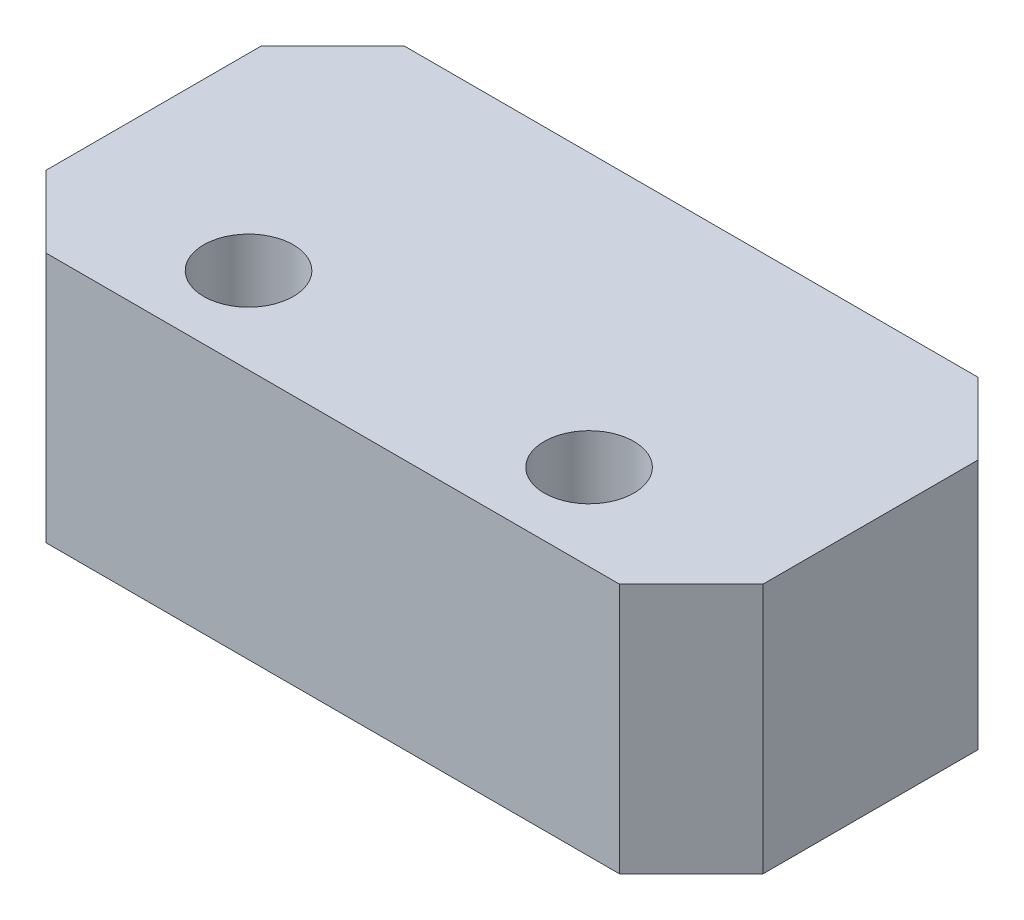
ISO-10303-21;
HEADER;
FILE_DESCRIPTION(('STEP AP214'),'2;1');
FILE_NAME('part.step','',(''),(''),'','','');
FILE_SCHEMA(('AUTOMOTIVE_DESIGN { 1 0 10303 214 1 1 1 1 }'));
ENDSEC;
DATA;
#1=APPLICATION_CONTEXT('core data for automotive mechanical design processes');
#2=APPLICATION_PROTOCOL_DEFINITION('international standard','automotive_design',2000,#1);
#3=PRODUCT_CONTEXT('',#1,'mechanical');
#4=PRODUCT('Part','Part','',(#3));
#5=PRODUCT_RELATED_PRODUCT_CATEGORY('part','',(#4));
#6=PRODUCT_DEFINITION_FORMATION('','',#4);
#7=PRODUCT_DEFINITION_CONTEXT('part definition',#1,'design');
#8=PRODUCT_DEFINITION('design','',#6,#7);
#9=PRODUCT_DEFINITION_SHAPE('','',#8);
#10=(LENGTH_UNIT() NAMED_UNIT(*) SI_UNIT(.MILLI.,.METRE.));
#11=(NAMED_UNIT(*) PLANE_ANGLE_UNIT() SI_UNIT($,.RADIAN.));
#12=(NAMED_UNIT(*) SI_UNIT($,.STERADIAN.) SOLID_ANGLE_UNIT());
#13=UNCERTAINTY_MEASURE_WITH_UNIT(LENGTH_MEASURE(1.E-05),#10,'distance_accuracy_value','');
#14=(GEOMETRIC_REPRESENTATION_CONTEXT(3) GLOBAL_UNCERTAINTY_ASSIGNED_CONTEXT((#13)) GLOBAL_UNIT_ASSIGNED_CONTEXT((#10,
#11,#12)) REPRESENTATION_CONTEXT('',''));
#15=CARTESIAN_POINT('',(0.,0.,0.));
#16=DIRECTION('',(0.,0.,1.));
#17=DIRECTION('',(1.,0.,0.));
#18=AXIS2_PLACEMENT_3D('',#15,#16,#17);
#19=CARTESIAN_POINT('',(0.,7.,0.));
#20=DIRECTION('',(0.,-1.,0.));
#21=DIRECTION('',(0.,0.,-1.));
#22=AXIS2_PLACEMENT_3D('',#19,#20,#21);
#23=PLANE('',#22);
#24=DIRECTION('',(-1.,0.,0.));
#25=VECTOR('',#24,1.);
#26=CARTESIAN_POINT('',(-10.,7.,-5.));
#27=LINE('',#26,#25);
#28=CARTESIAN_POINT('',(8.,7.,-5.));
#29=VERTEX_POINT('',#28);
#30=CARTESIAN_POINT('',(-7.99999999999999,7.,-5.));
#31=VERTEX_POINT('',#30);
#32=EDGE_CURVE('E170',#29,#31,#27,.T.);
#33=ORIENTED_EDGE('',*,*,#32,.T.);
#34=DIRECTION('',(0.707106781186548,0.,-0.707106781186547));
#35=VECTOR('',#34,1.);
#36=CARTESIAN_POINT('',(-10.,7.,-3.));
#37=LINE('',#36,#35);
#38=CARTESIAN_POINT('',(-10.,7.,-3.));
#39=VERTEX_POINT('',#38);
#40=EDGE_CURVE('E147',#31,#39,#37,.F.);
#41=ORIENTED_EDGE('',*,*,#40,.T.);
#42=DIRECTION('',(0.,0.,1.));
#43=VECTOR('',#42,1.);
#44=CARTESIAN_POINT('',(-10.,7.,5.));
#45=LINE('',#44,#43);
#46=CARTESIAN_POINT('',(-10.,7.,2.99999999999999));
#47=VERTEX_POINT('',#46);
#48=EDGE_CURVE('E117',#39,#47,#45,.T.);
#49=ORIENTED_EDGE('',*,*,#48,.T.);
#50=DIRECTION('',(-0.707106781186547,0.,-0.707106781186548));
#51=VECTOR('',#50,1.);
#52=CARTESIAN_POINT('',(-8.,7.,5.));
#53=LINE('',#52,#51);
#54=CARTESIAN_POINT('',(-8.,7.,5.));
#55=VERTEX_POINT('',#54);
#56=EDGE_CURVE('E54',#47,#55,#53,.F.);
#57=ORIENTED_EDGE('',*,*,#56,.T.);
#58=DIRECTION('',(1.,0.,0.));
#59=VECTOR('',#58,1.);
#60=CARTESIAN_POINT('',(-10.,7.,5.));
#61=LINE('',#60,#59);
#62=CARTESIAN_POINT('',(8.,7.,5.));
#63=VERTEX_POINT('',#62);
#64=EDGE_CURVE('E133',#55,#63,#61,.T.);
#65=ORIENTED_EDGE('',*,*,#64,.T.);
#66=DIRECTION('',(-0.707106781186548,0.,0.707106781186547));
#67=VECTOR('',#66,1.);
#68=CARTESIAN_POINT('',(10.,7.,3.));
#69=LINE('',#68,#67);
#70=CARTESIAN_POINT('',(10.,7.,3.));
#71=VERTEX_POINT('',#70);
#72=EDGE_CURVE('E142',#63,#71,#69,.F.);
#73=ORIENTED_EDGE('',*,*,#72,.T.);
#74=DIRECTION('',(0.,0.,-1.));
#75=VECTOR('',#74,1.);
#76=CARTESIAN_POINT('',(10.,7.,5.));
#77=LINE('',#76,#75);
#78=CARTESIAN_POINT('',(10.,7.,-3.));
#79=VERTEX_POINT('',#78);
#80=EDGE_CURVE('E127',#71,#79,#77,.T.);
#81=ORIENTED_EDGE('',*,*,#80,.T.);
#82=DIRECTION('',(0.707106781186547,0.,0.707106781186548));
#83=VECTOR('',#82,1.);
#84=CARTESIAN_POINT('',(8.,7.,-5.));
#85=LINE('',#84,#83);
#86=EDGE_CURVE('E144',#79,#29,#85,.F.);
#87=ORIENTED_EDGE('',*,*,#86,.T.);
#88=EDGE_LOOP('',(#33,#41,#49,#57,#65,#73,#81,#87));
#89=FACE_BOUND('',#88,.T.);
#90=CARTESIAN_POINT('',(-4.75,7.,2.6));
#91=DIRECTION('',(0.,1.,0.));
#92=DIRECTION('',(0.,0.,1.));
#93=AXIS2_PLACEMENT_3D('',#90,#91,#92);
#94=CIRCLE('',#93,1.25);
#95=CARTESIAN_POINT('',(-4.75,7.,3.85));
#96=VERTEX_POINT('',#95);
#97=EDGE_CURVE('E163',#96,#96,#94,.T.);
#98=ORIENTED_EDGE('',*,*,#97,.F.);
#99=EDGE_LOOP('',(#98));
#100=FACE_BOUND('',#99,.T.);
#101=CARTESIAN_POINT('',(4.75,7.,2.6));
#102=DIRECTION('',(0.,1.,0.));
#103=DIRECTION('',(0.,0.,1.));
#104=AXIS2_PLACEMENT_3D('',#101,#102,#103);
#105=CIRCLE('',#104,1.25);
#106=CARTESIAN_POINT('',(4.75,7.,3.85));
#107=VERTEX_POINT('',#106);
#108=EDGE_CURVE('E175',#107,#107,#105,.T.);
#109=ORIENTED_EDGE('',*,*,#108,.F.);
#110=EDGE_LOOP('',(#109));
#111=FACE_BOUND('',#110,.T.);
#112=ADVANCED_FACE('F32',(#89,#100,#111),#23,.F.);
#113=CARTESIAN_POINT('',(0.,0.,0.));
#114=DIRECTION('',(0.,-1.,0.));
#115=DIRECTION('',(0.,0.,-1.));
#116=AXIS2_PLACEMENT_3D('',#113,#114,#115);
#117=PLANE('',#116);
#118=CARTESIAN_POINT('',(-4.75,0.,2.6));
#119=DIRECTION('',(0.,1.,0.));
#120=DIRECTION('',(0.,0.,1.));
#121=AXIS2_PLACEMENT_3D('',#118,#119,#120);
#122=CIRCLE('',#121,1.25);
#123=CARTESIAN_POINT('',(-4.75,0.,3.85));
#124=VERTEX_POINT('',#123);
#125=EDGE_CURVE('E165',#124,#124,#122,.T.);
#126=ORIENTED_EDGE('',*,*,#125,.T.);
#127=EDGE_LOOP('',(#126));
#128=FACE_BOUND('',#127,.T.);
#129=DIRECTION('',(0.,0.,1.));
#130=VECTOR('',#129,1.);
#131=CARTESIAN_POINT('',(-10.,0.,5.));
#132=LINE('',#131,#130);
#133=CARTESIAN_POINT('',(-10.,0.,-3.));
#134=VERTEX_POINT('',#133);
#135=CARTESIAN_POINT('',(-10.,0.,2.99999999999999));
#136=VERTEX_POINT('',#135);
#137=EDGE_CURVE('E115',#134,#136,#132,.T.);
#138=ORIENTED_EDGE('',*,*,#137,.F.);
#139=DIRECTION('',(-0.707106781186548,0.,0.707106781186547));
#140=VECTOR('',#139,1.);
#141=CARTESIAN_POINT('',(-6.49999999999999,0.,-6.5));
#142=LINE('',#141,#140);
#143=CARTESIAN_POINT('',(-7.99999999999999,0.,-5.));
#144=VERTEX_POINT('',#143);
#145=EDGE_CURVE('E98',#134,#144,#142,.F.);
#146=ORIENTED_EDGE('',*,*,#145,.T.);
#147=DIRECTION('',(-1.,0.,0.));
#148=VECTOR('',#147,1.);
#149=CARTESIAN_POINT('',(-10.,0.,-5.));
#150=LINE('',#149,#148);
#151=CARTESIAN_POINT('',(8.,0.,-5.));
#152=VERTEX_POINT('',#151);
#153=EDGE_CURVE('E125',#152,#144,#150,.T.);
#154=ORIENTED_EDGE('',*,*,#153,.F.);
#155=DIRECTION('',(-0.707106781186547,0.,-0.707106781186548));
#156=VECTOR('',#155,1.);
#157=CARTESIAN_POINT('',(6.50000000000001,0.,-6.5));
#158=LINE('',#157,#156);
#159=CARTESIAN_POINT('',(10.,0.,-3.));
#160=VERTEX_POINT('',#159);
#161=EDGE_CURVE('E136',#152,#160,#158,.F.);
#162=ORIENTED_EDGE('',*,*,#161,.T.);
#163=DIRECTION('',(0.,0.,-1.));
#164=VECTOR('',#163,1.);
#165=CARTESIAN_POINT('',(10.,0.,5.));
#166=LINE('',#165,#164);
#167=CARTESIAN_POINT('',(10.,0.,3.));
#168=VERTEX_POINT('',#167);
#169=EDGE_CURVE('E129',#168,#160,#166,.T.);
#170=ORIENTED_EDGE('',*,*,#169,.F.);
#171=DIRECTION('',(0.707106781186548,0.,-0.707106781186547));
#172=VECTOR('',#171,1.);
#173=CARTESIAN_POINT('',(6.49999999999999,0.,6.5));
#174=LINE('',#173,#172);
#175=CARTESIAN_POINT('',(8.,0.,5.));
#176=VERTEX_POINT('',#175);
#177=EDGE_CURVE('E118',#168,#176,#174,.F.);
#178=ORIENTED_EDGE('',*,*,#177,.T.);
#179=DIRECTION('',(1.,0.,0.));
#180=VECTOR('',#179,1.);
#181=CARTESIAN_POINT('',(-10.,0.,5.));
#182=LINE('',#181,#180);
#183=CARTESIAN_POINT('',(-8.,0.,5.));
#184=VERTEX_POINT('',#183);
#185=EDGE_CURVE('E124',#184,#176,#182,.T.);
#186=ORIENTED_EDGE('',*,*,#185,.F.);
#187=DIRECTION('',(0.707106781186547,0.,0.707106781186548));
#188=VECTOR('',#187,1.);
#189=CARTESIAN_POINT('',(-6.50000000000001,0.,6.49999999999999));
#190=LINE('',#189,#188);
#191=EDGE_CURVE('E109',#184,#136,#190,.F.);
#192=ORIENTED_EDGE('',*,*,#191,.T.);
#193=EDGE_LOOP('',(#138,#146,#154,#162,#170,#178,#186,#192));
#194=FACE_BOUND('',#193,.T.);
#195=CARTESIAN_POINT('',(4.75,0.,2.6));
#196=DIRECTION('',(0.,1.,0.));
#197=DIRECTION('',(0.,0.,1.));
#198=AXIS2_PLACEMENT_3D('',#195,#196,#197);
#199=CIRCLE('',#198,1.25);
#200=CARTESIAN_POINT('',(4.75,0.,3.85));
#201=VERTEX_POINT('',#200);
#202=EDGE_CURVE('E177',#201,#201,#199,.T.);
#203=ORIENTED_EDGE('',*,*,#202,.T.);
#204=EDGE_LOOP('',(#203));
#205=FACE_BOUND('',#204,.T.);
#206=ADVANCED_FACE('F121',(#128,#194,#205),#117,.T.);
#207=CARTESIAN_POINT('',(10.,7.,5.));
#208=DIRECTION('',(-1.,0.,0.));
#209=DIRECTION('',(0.,0.,1.));
#210=AXIS2_PLACEMENT_3D('',#207,#208,#209);
#211=PLANE('',#210);
#212=ORIENTED_EDGE('',*,*,#169,.T.);
#213=DIRECTION('',(0.,1.,0.));
#214=VECTOR('',#213,1.);
#215=CARTESIAN_POINT('',(10.,7.,-3.));
#216=LINE('',#215,#214);
#217=EDGE_CURVE('E11',#160,#79,#216,.T.);
#218=ORIENTED_EDGE('',*,*,#217,.T.);
#219=ORIENTED_EDGE('',*,*,#80,.F.);
#220=DIRECTION('',(0.,-1.,0.));
#221=VECTOR('',#220,1.);
#222=CARTESIAN_POINT('',(10.,7.,3.));
#223=LINE('',#222,#221);
#224=EDGE_CURVE('E40',#71,#168,#223,.T.);
#225=ORIENTED_EDGE('',*,*,#224,.T.);
#226=EDGE_LOOP('',(#212,#218,#219,#225));
#227=FACE_BOUND('',#226,.T.);
#228=ADVANCED_FACE('F158',(#227),#211,.F.);
#229=CARTESIAN_POINT('',(-10.,7.,-5.));
#230=DIRECTION('',(0.,0.,1.));
#231=DIRECTION('',(1.,0.,0.));
#232=AXIS2_PLACEMENT_3D('',#229,#230,#231);
#233=PLANE('',#232);
#234=ORIENTED_EDGE('',*,*,#153,.T.);
#235=DIRECTION('',(0.,1.,0.));
#236=VECTOR('',#235,1.);
#237=CARTESIAN_POINT('',(-7.99999999999999,7.,-5.));
#238=LINE('',#237,#236);
#239=EDGE_CURVE('E103',#144,#31,#238,.T.);
#240=ORIENTED_EDGE('',*,*,#239,.T.);
#241=ORIENTED_EDGE('',*,*,#32,.F.);
#242=DIRECTION('',(0.,-1.,0.));
#243=VECTOR('',#242,1.);
#244=CARTESIAN_POINT('',(8.,7.,-5.));
#245=LINE('',#244,#243);
#246=EDGE_CURVE('E108',#29,#152,#245,.T.);
#247=ORIENTED_EDGE('',*,*,#246,.T.);
#248=EDGE_LOOP('',(#234,#240,#241,#247));
#249=FACE_BOUND('',#248,.T.);
#250=ADVANCED_FACE('F203',(#249),#233,.F.);
#251=CARTESIAN_POINT('',(-10.,7.,5.));
#252=DIRECTION('',(1.,0.,0.));
#253=DIRECTION('',(0.,0.,-1.));
#254=AXIS2_PLACEMENT_3D('',#251,#252,#253);
#255=PLANE('',#254);
#256=ORIENTED_EDGE('',*,*,#48,.F.);
#257=DIRECTION('',(0.,-1.,0.));
#258=VECTOR('',#257,1.);
#259=CARTESIAN_POINT('',(-10.,7.,-3.));
#260=LINE('',#259,#258);
#261=EDGE_CURVE('E102',#39,#134,#260,.T.);
#262=ORIENTED_EDGE('',*,*,#261,.T.);
#263=ORIENTED_EDGE('',*,*,#137,.T.);
#264=DIRECTION('',(0.,1.,0.));
#265=VECTOR('',#264,1.);
#266=CARTESIAN_POINT('',(-10.,7.,2.99999999999999));
#267=LINE('',#266,#265);
#268=EDGE_CURVE('E119',#136,#47,#267,.T.);
#269=ORIENTED_EDGE('',*,*,#268,.T.);
#270=EDGE_LOOP('',(#256,#262,#263,#269));
#271=FACE_BOUND('',#270,.T.);
#272=ADVANCED_FACE('F114',(#271),#255,.F.);
#273=CARTESIAN_POINT('',(-10.,7.,5.));
#274=DIRECTION('',(0.,0.,-1.));
#275=DIRECTION('',(-1.,0.,0.));
#276=AXIS2_PLACEMENT_3D('',#273,#274,#275);
#277=PLANE('',#276);
#278=ORIENTED_EDGE('',*,*,#64,.F.);
#279=DIRECTION('',(0.,-1.,0.));
#280=VECTOR('',#279,1.);
#281=CARTESIAN_POINT('',(-8.,7.,5.));
#282=LINE('',#281,#280);
#283=EDGE_CURVE('E150',#55,#184,#282,.T.);
#284=ORIENTED_EDGE('',*,*,#283,.T.);
#285=ORIENTED_EDGE('',*,*,#185,.T.);
#286=DIRECTION('',(0.,1.,0.));
#287=VECTOR('',#286,1.);
#288=CARTESIAN_POINT('',(8.,7.,5.));
#289=LINE('',#288,#287);
#290=EDGE_CURVE('E47',#176,#63,#289,.T.);
#291=ORIENTED_EDGE('',*,*,#290,.T.);
#292=EDGE_LOOP('',(#278,#284,#285,#291));
#293=FACE_BOUND('',#292,.T.);
#294=ADVANCED_FACE('F198',(#293),#277,.F.);
#295=CARTESIAN_POINT('',(-4.75,7.,2.6));
#296=DIRECTION('',(0.,-1.,0.));
#297=DIRECTION('',(0.,0.,-1.));
#298=AXIS2_PLACEMENT_3D('',#295,#296,#297);
#299=CYLINDRICAL_SURFACE('',#298,1.25);
#300=ORIENTED_EDGE('',*,*,#97,.T.);
#301=EDGE_LOOP('',(#300));
#302=FACE_BOUND('',#301,.T.);
#303=ORIENTED_EDGE('',*,*,#125,.F.);
#304=EDGE_LOOP('',(#303));
#305=FACE_BOUND('',#304,.T.);
#306=ADVANCED_FACE('F195',(#302,#305),#299,.F.);
#307=CARTESIAN_POINT('',(4.75,7.,2.6));
#308=DIRECTION('',(0.,-1.,0.));
#309=DIRECTION('',(0.,0.,-1.));
#310=AXIS2_PLACEMENT_3D('',#307,#308,#309);
#311=CYLINDRICAL_SURFACE('',#310,1.25);
#312=ORIENTED_EDGE('',*,*,#108,.T.);
#313=EDGE_LOOP('',(#312));
#314=FACE_BOUND('',#313,.T.);
#315=ORIENTED_EDGE('',*,*,#202,.F.);
#316=EDGE_LOOP('',(#315));
#317=FACE_BOUND('',#316,.T.);
#318=ADVANCED_FACE('F183',(#314,#317),#311,.F.);
#319=CARTESIAN_POINT('',(-10.,7.,-3.));
#320=DIRECTION('',(0.707106781186547,0.,0.707106781186548));
#321=DIRECTION('',(0.,-1.,0.));
#322=AXIS2_PLACEMENT_3D('',#319,#320,#321);
#323=PLANE('',#322);
#324=ORIENTED_EDGE('',*,*,#40,.F.);
#325=ORIENTED_EDGE('',*,*,#239,.F.);
#326=ORIENTED_EDGE('',*,*,#145,.F.);
#327=ORIENTED_EDGE('',*,*,#261,.F.);
#328=EDGE_LOOP('',(#324,#325,#326,#327));
#329=FACE_BOUND('',#328,.T.);
#330=ADVANCED_FACE('F101',(#329),#323,.F.);
#331=CARTESIAN_POINT('',(-8.,7.,5.));
#332=DIRECTION('',(0.707106781186548,0.,-0.707106781186547));
#333=DIRECTION('',(0.,-1.,0.));
#334=AXIS2_PLACEMENT_3D('',#331,#332,#333);
#335=PLANE('',#334);
#336=ORIENTED_EDGE('',*,*,#56,.F.);
#337=ORIENTED_EDGE('',*,*,#268,.F.);
#338=ORIENTED_EDGE('',*,*,#191,.F.);
#339=ORIENTED_EDGE('',*,*,#283,.F.);
#340=EDGE_LOOP('',(#336,#337,#338,#339));
#341=FACE_BOUND('',#340,.T.);
#342=ADVANCED_FACE('F211',(#341),#335,.F.);
#343=CARTESIAN_POINT('',(8.,7.,-5.));
#344=DIRECTION('',(-0.707106781186548,0.,0.707106781186547));
#345=DIRECTION('',(0.,-1.,0.));
#346=AXIS2_PLACEMENT_3D('',#343,#344,#345);
#347=PLANE('',#346);
#348=ORIENTED_EDGE('',*,*,#86,.F.);
#349=ORIENTED_EDGE('',*,*,#217,.F.);
#350=ORIENTED_EDGE('',*,*,#161,.F.);
#351=ORIENTED_EDGE('',*,*,#246,.F.);
#352=EDGE_LOOP('',(#348,#349,#350,#351));
#353=FACE_BOUND('',#352,.T.);
#354=ADVANCED_FACE('F213',(#353),#347,.F.);
#355=CARTESIAN_POINT('',(10.,7.,3.));
#356=DIRECTION('',(-0.707106781186547,0.,-0.707106781186548));
#357=DIRECTION('',(0.,-1.,0.));
#358=AXIS2_PLACEMENT_3D('',#355,#356,#357);
#359=PLANE('',#358);
#360=ORIENTED_EDGE('',*,*,#72,.F.);
#361=ORIENTED_EDGE('',*,*,#290,.F.);
#362=ORIENTED_EDGE('',*,*,#177,.F.);
#363=ORIENTED_EDGE('',*,*,#224,.F.);
#364=EDGE_LOOP('',(#360,#361,#362,#363));
#365=FACE_BOUND('',#364,.T.);
#366=ADVANCED_FACE('F34',(#365),#359,.F.);
#367=CLOSED_SHELL('',(#112,#206,#228,#250,#272,#294,#306,#318,#330,#342,#354,#366));
#368=MANIFOLD_SOLID_BREP('B2',#367);
#369=ADVANCED_BREP_SHAPE_REPRESENTATION('',(#18,#368),#14);
#370=SHAPE_DEFINITION_REPRESENTATION(#9,#369);
ENDSEC;
END-ISO-10303-21;
